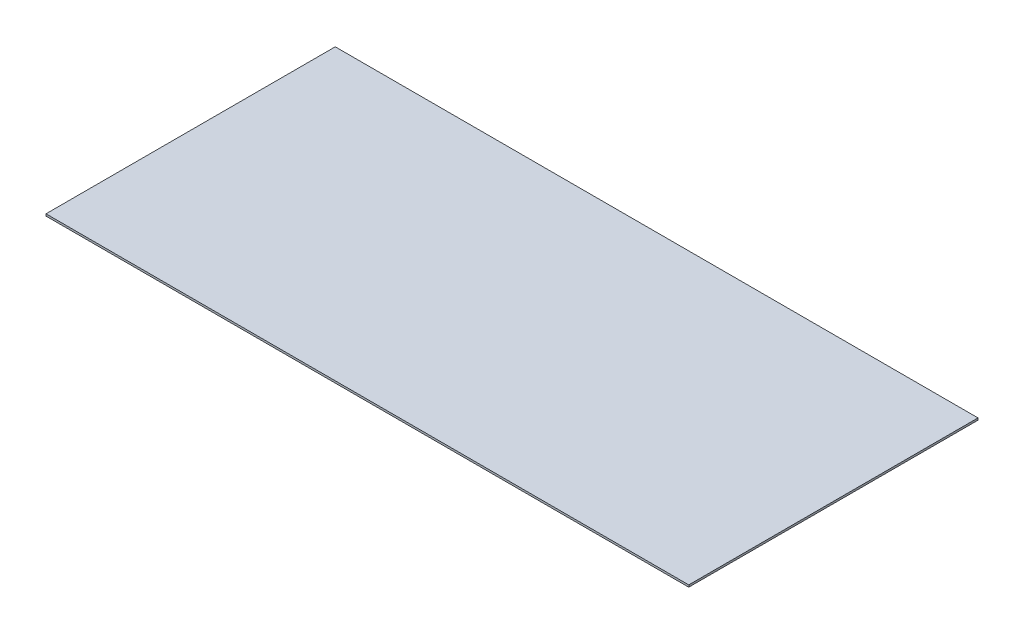
ISO-10303-21;
HEADER;
FILE_DESCRIPTION(('STEP AP214'),'2;1');
FILE_NAME('part.step','',(''),(''),'','','');
FILE_SCHEMA(('AUTOMOTIVE_DESIGN { 1 0 10303 214 1 1 1 1 }'));
ENDSEC;
DATA;
#1=APPLICATION_CONTEXT('core data for automotive mechanical design processes');
#2=APPLICATION_PROTOCOL_DEFINITION('international standard','automotive_design',2000,#1);
#3=PRODUCT_CONTEXT('',#1,'mechanical');
#4=PRODUCT('Part','Part','',(#3));
#5=PRODUCT_RELATED_PRODUCT_CATEGORY('part','',(#4));
#6=PRODUCT_DEFINITION_FORMATION('','',#4);
#7=PRODUCT_DEFINITION_CONTEXT('part definition',#1,'design');
#8=PRODUCT_DEFINITION('design','',#6,#7);
#9=PRODUCT_DEFINITION_SHAPE('','',#8);
#10=(LENGTH_UNIT() NAMED_UNIT(*) SI_UNIT(.MILLI.,.METRE.));
#11=(NAMED_UNIT(*) PLANE_ANGLE_UNIT() SI_UNIT($,.RADIAN.));
#12=(NAMED_UNIT(*) SI_UNIT($,.STERADIAN.) SOLID_ANGLE_UNIT());
#13=UNCERTAINTY_MEASURE_WITH_UNIT(LENGTH_MEASURE(1.E-05),#10,'distance_accuracy_value','');
#14=(GEOMETRIC_REPRESENTATION_CONTEXT(3) GLOBAL_UNCERTAINTY_ASSIGNED_CONTEXT((#13)) GLOBAL_UNIT_ASSIGNED_CONTEXT((#10,
#11,#12)) REPRESENTATION_CONTEXT('',''));
#15=CARTESIAN_POINT('',(0.,0.,0.));
#16=DIRECTION('',(0.,0.,1.));
#17=DIRECTION('',(1.,0.,0.));
#18=AXIS2_PLACEMENT_3D('',#15,#16,#17);
#19=CARTESIAN_POINT('',(-1016.,6.35,457.2));
#20=DIRECTION('',(1.,0.,0.));
#21=DIRECTION('',(0.,0.,-1.));
#22=AXIS2_PLACEMENT_3D('',#19,#20,#21);
#23=PLANE('',#22);
#24=DIRECTION('',(0.,0.,1.));
#25=VECTOR('',#24,1.);
#26=CARTESIAN_POINT('',(-1016.,0.,457.2));
#27=LINE('',#26,#25);
#28=CARTESIAN_POINT('',(-1016.,0.,-457.2));
#29=VERTEX_POINT('',#28);
#30=CARTESIAN_POINT('',(-1016.,0.,457.2));
#31=VERTEX_POINT('',#30);
#32=EDGE_CURVE('E96',#29,#31,#27,.T.);
#33=ORIENTED_EDGE('',*,*,#32,.T.);
#34=DIRECTION('',(0.,-1.,0.));
#35=VECTOR('',#34,1.);
#36=CARTESIAN_POINT('',(-1016.,6.35,457.2));
#37=LINE('',#36,#35);
#38=CARTESIAN_POINT('',(-1016.,6.35,457.2));
#39=VERTEX_POINT('',#38);
#40=EDGE_CURVE('E11',#39,#31,#37,.T.);
#41=ORIENTED_EDGE('',*,*,#40,.F.);
#42=DIRECTION('',(0.,0.,1.));
#43=VECTOR('',#42,1.);
#44=CARTESIAN_POINT('',(-1016.,6.35,457.2));
#45=LINE('',#44,#43);
#46=CARTESIAN_POINT('',(-1016.,6.35,-457.2));
#47=VERTEX_POINT('',#46);
#48=EDGE_CURVE('E84',#47,#39,#45,.T.);
#49=ORIENTED_EDGE('',*,*,#48,.F.);
#50=DIRECTION('',(0.,-1.,0.));
#51=VECTOR('',#50,1.);
#52=CARTESIAN_POINT('',(-1016.,6.35,-457.2));
#53=LINE('',#52,#51);
#54=EDGE_CURVE('E92',#47,#29,#53,.T.);
#55=ORIENTED_EDGE('',*,*,#54,.T.);
#56=EDGE_LOOP('',(#33,#41,#49,#55));
#57=FACE_BOUND('',#56,.T.);
#58=ADVANCED_FACE('F33',(#57),#23,.F.);
#59=CARTESIAN_POINT('',(1016.,6.35,457.2));
#60=DIRECTION('',(0.,0.,-1.));
#61=DIRECTION('',(-1.,0.,0.));
#62=AXIS2_PLACEMENT_3D('',#59,#60,#61);
#63=PLANE('',#62);
#64=DIRECTION('',(1.,0.,0.));
#65=VECTOR('',#64,1.);
#66=CARTESIAN_POINT('',(1016.,0.,457.2));
#67=LINE('',#66,#65);
#68=CARTESIAN_POINT('',(1016.,0.,457.2));
#69=VERTEX_POINT('',#68);
#70=EDGE_CURVE('E88',#31,#69,#67,.T.);
#71=ORIENTED_EDGE('',*,*,#70,.T.);
#72=DIRECTION('',(0.,-1.,0.));
#73=VECTOR('',#72,1.);
#74=CARTESIAN_POINT('',(1016.,6.35,457.2));
#75=LINE('',#74,#73);
#76=CARTESIAN_POINT('',(1016.,6.35,457.2));
#77=VERTEX_POINT('',#76);
#78=EDGE_CURVE('E41',#77,#69,#75,.T.);
#79=ORIENTED_EDGE('',*,*,#78,.F.);
#80=DIRECTION('',(1.,0.,0.));
#81=VECTOR('',#80,1.);
#82=CARTESIAN_POINT('',(1016.,6.35,457.2));
#83=LINE('',#82,#81);
#84=EDGE_CURVE('E79',#39,#77,#83,.T.);
#85=ORIENTED_EDGE('',*,*,#84,.F.);
#86=ORIENTED_EDGE('',*,*,#40,.T.);
#87=EDGE_LOOP('',(#71,#79,#85,#86));
#88=FACE_BOUND('',#87,.T.);
#89=ADVANCED_FACE('F87',(#88),#63,.F.);
#90=CARTESIAN_POINT('',(1016.,6.35,457.2));
#91=DIRECTION('',(-1.,0.,0.));
#92=DIRECTION('',(0.,0.,1.));
#93=AXIS2_PLACEMENT_3D('',#90,#91,#92);
#94=PLANE('',#93);
#95=DIRECTION('',(0.,0.,-1.));
#96=VECTOR('',#95,1.);
#97=CARTESIAN_POINT('',(1016.,0.,457.2));
#98=LINE('',#97,#96);
#99=CARTESIAN_POINT('',(1016.,0.,-457.2));
#100=VERTEX_POINT('',#99);
#101=EDGE_CURVE('E66',#69,#100,#98,.T.);
#102=ORIENTED_EDGE('',*,*,#101,.T.);
#103=DIRECTION('',(0.,-1.,0.));
#104=VECTOR('',#103,1.);
#105=CARTESIAN_POINT('',(1016.,6.35,-457.2));
#106=LINE('',#105,#104);
#107=CARTESIAN_POINT('',(1016.,6.35,-457.2));
#108=VERTEX_POINT('',#107);
#109=EDGE_CURVE('E89',#108,#100,#106,.T.);
#110=ORIENTED_EDGE('',*,*,#109,.F.);
#111=DIRECTION('',(0.,0.,-1.));
#112=VECTOR('',#111,1.);
#113=CARTESIAN_POINT('',(1016.,6.35,457.2));
#114=LINE('',#113,#112);
#115=EDGE_CURVE('E82',#77,#108,#114,.T.);
#116=ORIENTED_EDGE('',*,*,#115,.F.);
#117=ORIENTED_EDGE('',*,*,#78,.T.);
#118=EDGE_LOOP('',(#102,#110,#116,#117));
#119=FACE_BOUND('',#118,.T.);
#120=ADVANCED_FACE('F90',(#119),#94,.F.);
#121=CARTESIAN_POINT('',(1016.,6.35,-457.2));
#122=DIRECTION('',(0.,0.,1.));
#123=DIRECTION('',(1.,0.,0.));
#124=AXIS2_PLACEMENT_3D('',#121,#122,#123);
#125=PLANE('',#124);
#126=DIRECTION('',(-1.,0.,0.));
#127=VECTOR('',#126,1.);
#128=CARTESIAN_POINT('',(1016.,0.,-457.2));
#129=LINE('',#128,#127);
#130=EDGE_CURVE('E72',#100,#29,#129,.T.);
#131=ORIENTED_EDGE('',*,*,#130,.T.);
#132=ORIENTED_EDGE('',*,*,#54,.F.);
#133=DIRECTION('',(-1.,0.,0.));
#134=VECTOR('',#133,1.);
#135=CARTESIAN_POINT('',(1016.,6.35,-457.2));
#136=LINE('',#135,#134);
#137=EDGE_CURVE('E49',#108,#47,#136,.T.);
#138=ORIENTED_EDGE('',*,*,#137,.F.);
#139=ORIENTED_EDGE('',*,*,#109,.T.);
#140=EDGE_LOOP('',(#131,#132,#138,#139));
#141=FACE_BOUND('',#140,.T.);
#142=ADVANCED_FACE('F103',(#141),#125,.F.);
#143=CARTESIAN_POINT('',(0.,6.35,0.));
#144=DIRECTION('',(0.,1.,0.));
#145=DIRECTION('',(0.,0.,1.));
#146=AXIS2_PLACEMENT_3D('',#143,#144,#145);
#147=PLANE('',#146);
#148=ORIENTED_EDGE('',*,*,#48,.T.);
#149=ORIENTED_EDGE('',*,*,#84,.T.);
#150=ORIENTED_EDGE('',*,*,#115,.T.);
#151=ORIENTED_EDGE('',*,*,#137,.T.);
#152=EDGE_LOOP('',(#148,#149,#150,#151));
#153=FACE_BOUND('',#152,.T.);
#154=ADVANCED_FACE('F80',(#153),#147,.T.);
#155=CARTESIAN_POINT('',(0.,0.,0.));
#156=DIRECTION('',(0.,1.,0.));
#157=DIRECTION('',(0.,0.,1.));
#158=AXIS2_PLACEMENT_3D('',#155,#156,#157);
#159=PLANE('',#158);
#160=ORIENTED_EDGE('',*,*,#32,.F.);
#161=ORIENTED_EDGE('',*,*,#130,.F.);
#162=ORIENTED_EDGE('',*,*,#101,.F.);
#163=ORIENTED_EDGE('',*,*,#70,.F.);
#164=EDGE_LOOP('',(#160,#161,#162,#163));
#165=FACE_BOUND('',#164,.T.);
#166=ADVANCED_FACE('F106',(#165),#159,.F.);
#167=CLOSED_SHELL('',(#58,#89,#120,#142,#154,#166));
#168=MANIFOLD_SOLID_BREP('B2',#167);
#169=ADVANCED_BREP_SHAPE_REPRESENTATION('',(#18,#168),#14);
#170=SHAPE_DEFINITION_REPRESENTATION(#9,#169);
ENDSEC;
END-ISO-10303-21;
